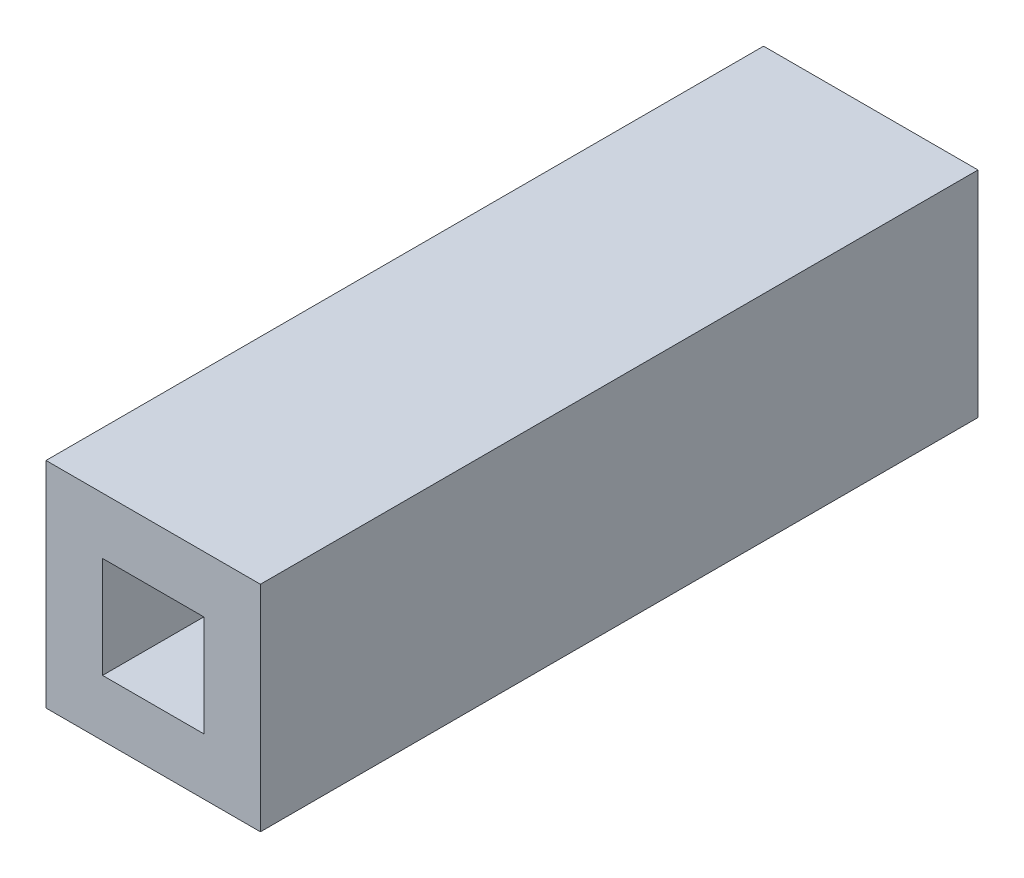
ISO-10303-21;
HEADER;
FILE_DESCRIPTION(('STEP AP214'),'2;1');
FILE_NAME('part.step','',(''),(''),'','','');
FILE_SCHEMA(('AUTOMOTIVE_DESIGN { 1 0 10303 214 1 1 1 1 }'));
ENDSEC;
DATA;
#1=APPLICATION_CONTEXT('core data for automotive mechanical design processes');
#2=APPLICATION_PROTOCOL_DEFINITION('international standard','automotive_design',2000,#1);
#3=PRODUCT_CONTEXT('',#1,'mechanical');
#4=PRODUCT('Part','Part','',(#3));
#5=PRODUCT_RELATED_PRODUCT_CATEGORY('part','',(#4));
#6=PRODUCT_DEFINITION_FORMATION('','',#4);
#7=PRODUCT_DEFINITION_CONTEXT('part definition',#1,'design');
#8=PRODUCT_DEFINITION('design','',#6,#7);
#9=PRODUCT_DEFINITION_SHAPE('','',#8);
#10=(LENGTH_UNIT() NAMED_UNIT(*) SI_UNIT(.MILLI.,.METRE.));
#11=(NAMED_UNIT(*) PLANE_ANGLE_UNIT() SI_UNIT($,.RADIAN.));
#12=(NAMED_UNIT(*) SI_UNIT($,.STERADIAN.) SOLID_ANGLE_UNIT());
#13=UNCERTAINTY_MEASURE_WITH_UNIT(LENGTH_MEASURE(1.E-05),#10,'distance_accuracy_value','');
#14=(GEOMETRIC_REPRESENTATION_CONTEXT(3) GLOBAL_UNCERTAINTY_ASSIGNED_CONTEXT((#13)) GLOBAL_UNIT_ASSIGNED_CONTEXT((#10,
#11,#12)) REPRESENTATION_CONTEXT('',''));
#15=CARTESIAN_POINT('',(0.,0.,0.));
#16=DIRECTION('',(0.,0.,1.));
#17=DIRECTION('',(1.,0.,0.));
#18=AXIS2_PLACEMENT_3D('',#15,#16,#17);
#19=CARTESIAN_POINT('',(7.841173791275,29.409000078524,-10.));
#20=DIRECTION('',(1.,0.,0.));
#21=DIRECTION('',(0.,1.,0.));
#22=AXIS2_PLACEMENT_3D('',#19,#20,#21);
#23=PLANE('',#22);
#24=DIRECTION('',(0.,1.,0.));
#25=VECTOR('',#24,1.);
#26=CARTESIAN_POINT('',(7.841173791275,29.409000078524,-1.5));
#27=LINE('',#26,#25);
#28=CARTESIAN_POINT('',(7.841173791275,28.139000078524,-1.5));
#29=VERTEX_POINT('',#28);
#30=CARTESIAN_POINT('',(7.841173791275,30.679000078524,-1.5));
#31=VERTEX_POINT('',#30);
#32=EDGE_CURVE('E224',#29,#31,#27,.T.);
#33=ORIENTED_EDGE('',*,*,#32,.F.);
#34=DIRECTION('',(0.,0.,1.));
#35=VECTOR('',#34,1.);
#36=CARTESIAN_POINT('',(7.841173791275,28.139000078524,-10.));
#37=LINE('',#36,#35);
#38=CARTESIAN_POINT('',(7.841173791275,28.139000078524,-10.));
#39=VERTEX_POINT('',#38);
#40=EDGE_CURVE('E11',#39,#29,#37,.T.);
#41=ORIENTED_EDGE('',*,*,#40,.F.);
#42=DIRECTION('',(0.,1.,0.));
#43=VECTOR('',#42,1.);
#44=CARTESIAN_POINT('',(7.841173791275,29.409000078524,-10.));
#45=LINE('',#44,#43);
#46=CARTESIAN_POINT('',(7.841173791275,30.679000078524,-10.));
#47=VERTEX_POINT('',#46);
#48=EDGE_CURVE('E181',#39,#47,#45,.T.);
#49=ORIENTED_EDGE('',*,*,#48,.T.);
#50=DIRECTION('',(0.,0.,1.));
#51=VECTOR('',#50,1.);
#52=CARTESIAN_POINT('',(7.841173791275,30.679000078524,-10.));
#53=LINE('',#52,#51);
#54=EDGE_CURVE('E21',#47,#31,#53,.T.);
#55=ORIENTED_EDGE('',*,*,#54,.T.);
#56=EDGE_LOOP('',(#33,#41,#49,#55));
#57=FACE_BOUND('',#56,.T.);
#58=ADVANCED_FACE('F17',(#57),#23,.T.);
#59=CARTESIAN_POINT('',(6.571173791275,28.139000078524,-10.));
#60=DIRECTION('',(0.,1.,0.));
#61=DIRECTION('',(1.,0.,0.));
#62=AXIS2_PLACEMENT_3D('',#59,#60,#61);
#63=PLANE('',#62);
#64=DIRECTION('',(-1.,0.,0.));
#65=VECTOR('',#64,1.);
#66=CARTESIAN_POINT('',(6.571173791275,28.139000078524,-1.5));
#67=LINE('',#66,#65);
#68=CARTESIAN_POINT('',(5.301173791275,28.139000078524,-1.5));
#69=VERTEX_POINT('',#68);
#70=EDGE_CURVE('E186',#29,#69,#67,.T.);
#71=ORIENTED_EDGE('',*,*,#70,.T.);
#72=DIRECTION('',(0.,0.,1.));
#73=VECTOR('',#72,1.);
#74=CARTESIAN_POINT('',(5.301173791275,28.139000078524,-10.));
#75=LINE('',#74,#73);
#76=CARTESIAN_POINT('',(5.301173791275,28.139000078524,-10.));
#77=VERTEX_POINT('',#76);
#78=EDGE_CURVE('E27',#77,#69,#75,.T.);
#79=ORIENTED_EDGE('',*,*,#78,.F.);
#80=DIRECTION('',(-1.,0.,0.));
#81=VECTOR('',#80,1.);
#82=CARTESIAN_POINT('',(6.571173791275,28.139000078524,-10.));
#83=LINE('',#82,#81);
#84=EDGE_CURVE('E177',#39,#77,#83,.T.);
#85=ORIENTED_EDGE('',*,*,#84,.F.);
#86=ORIENTED_EDGE('',*,*,#40,.T.);
#87=EDGE_LOOP('',(#71,#79,#85,#86));
#88=FACE_BOUND('',#87,.T.);
#89=ADVANCED_FACE('F19',(#88),#63,.F.);
#90=CARTESIAN_POINT('',(5.301173791275,29.409000078524,-10.));
#91=DIRECTION('',(1.,0.,0.));
#92=DIRECTION('',(0.,1.,0.));
#93=AXIS2_PLACEMENT_3D('',#90,#91,#92);
#94=PLANE('',#93);
#95=DIRECTION('',(0.,1.,0.));
#96=VECTOR('',#95,1.);
#97=CARTESIAN_POINT('',(5.301173791275,29.409000078524,-1.5));
#98=LINE('',#97,#96);
#99=CARTESIAN_POINT('',(5.301173791275,30.679000078524,-1.5));
#100=VERTEX_POINT('',#99);
#101=EDGE_CURVE('E232',#69,#100,#98,.T.);
#102=ORIENTED_EDGE('',*,*,#101,.T.);
#103=DIRECTION('',(0.,0.,1.));
#104=VECTOR('',#103,1.);
#105=CARTESIAN_POINT('',(5.301173791275,30.679000078524,-10.));
#106=LINE('',#105,#104);
#107=CARTESIAN_POINT('',(5.301173791275,30.679000078524,-10.));
#108=VERTEX_POINT('',#107);
#109=EDGE_CURVE('E40',#108,#100,#106,.T.);
#110=ORIENTED_EDGE('',*,*,#109,.F.);
#111=DIRECTION('',(0.,1.,0.));
#112=VECTOR('',#111,1.);
#113=CARTESIAN_POINT('',(5.301173791275,29.409000078524,-10.));
#114=LINE('',#113,#112);
#115=EDGE_CURVE('E180',#77,#108,#114,.T.);
#116=ORIENTED_EDGE('',*,*,#115,.F.);
#117=ORIENTED_EDGE('',*,*,#78,.T.);
#118=EDGE_LOOP('',(#102,#110,#116,#117));
#119=FACE_BOUND('',#118,.T.);
#120=ADVANCED_FACE('F257',(#119),#94,.F.);
#121=CARTESIAN_POINT('',(6.571173791275,30.679000078524,-10.));
#122=DIRECTION('',(0.,1.,0.));
#123=DIRECTION('',(1.,0.,0.));
#124=AXIS2_PLACEMENT_3D('',#121,#122,#123);
#125=PLANE('',#124);
#126=DIRECTION('',(-1.,0.,0.));
#127=VECTOR('',#126,1.);
#128=CARTESIAN_POINT('',(6.571173791275,30.679000078524,-1.5));
#129=LINE('',#128,#127);
#130=EDGE_CURVE('E228',#31,#100,#129,.T.);
#131=ORIENTED_EDGE('',*,*,#130,.F.);
#132=ORIENTED_EDGE('',*,*,#54,.F.);
#133=DIRECTION('',(-1.,0.,0.));
#134=VECTOR('',#133,1.);
#135=CARTESIAN_POINT('',(6.571173791275,30.679000078524,-10.));
#136=LINE('',#135,#134);
#137=EDGE_CURVE('E239',#47,#108,#136,.T.);
#138=ORIENTED_EDGE('',*,*,#137,.T.);
#139=ORIENTED_EDGE('',*,*,#109,.T.);
#140=EDGE_LOOP('',(#131,#132,#138,#139));
#141=FACE_BOUND('',#140,.T.);
#142=ADVANCED_FACE('F252',(#141),#125,.T.);
#143=CARTESIAN_POINT('',(6.571173791275,29.409000078524,-10.));
#144=DIRECTION('',(0.,0.,-1.));
#145=DIRECTION('',(0.,-1.,0.));
#146=AXIS2_PLACEMENT_3D('',#143,#144,#145);
#147=PLANE('',#146);
#148=DIRECTION('',(1.,0.,0.));
#149=VECTOR('',#148,1.);
#150=CARTESIAN_POINT('',(7.171173791275,28.459000078524,-10.));
#151=LINE('',#150,#149);
#152=CARTESIAN_POINT('',(5.621173791275,28.459000078524,-10.));
#153=VERTEX_POINT('',#152);
#154=CARTESIAN_POINT('',(7.521173791275,28.459000078524,-10.));
#155=VERTEX_POINT('',#154);
#156=EDGE_CURVE('E122',#153,#155,#151,.T.);
#157=ORIENTED_EDGE('',*,*,#156,.T.);
#158=DIRECTION('',(0.,1.,0.));
#159=VECTOR('',#158,1.);
#160=CARTESIAN_POINT('',(7.521173791275,29.409000078524,-10.));
#161=LINE('',#160,#159);
#162=CARTESIAN_POINT('',(7.521173791275,30.359000078524,-10.));
#163=VERTEX_POINT('',#162);
#164=EDGE_CURVE('E127',#155,#163,#161,.T.);
#165=ORIENTED_EDGE('',*,*,#164,.T.);
#166=DIRECTION('',(-1.,0.,0.));
#167=VECTOR('',#166,1.);
#168=CARTESIAN_POINT('',(6.571173791275,30.359000078524,-10.));
#169=LINE('',#168,#167);
#170=CARTESIAN_POINT('',(5.621173791275,30.359000078524,-10.));
#171=VERTEX_POINT('',#170);
#172=EDGE_CURVE('E163',#163,#171,#169,.T.);
#173=ORIENTED_EDGE('',*,*,#172,.T.);
#174=DIRECTION('',(0.,-1.,0.));
#175=VECTOR('',#174,1.);
#176=CARTESIAN_POINT('',(5.621173791275,28.809000078524,-10.));
#177=LINE('',#176,#175);
#178=EDGE_CURVE('E129',#171,#153,#177,.T.);
#179=ORIENTED_EDGE('',*,*,#178,.T.);
#180=EDGE_LOOP('',(#157,#165,#173,#179));
#181=FACE_BOUND('',#180,.T.);
#182=ORIENTED_EDGE('',*,*,#48,.F.);
#183=ORIENTED_EDGE('',*,*,#84,.T.);
#184=ORIENTED_EDGE('',*,*,#115,.T.);
#185=ORIENTED_EDGE('',*,*,#137,.F.);
#186=EDGE_LOOP('',(#182,#183,#184,#185));
#187=FACE_BOUND('',#186,.T.);
#188=ADVANCED_FACE('F124',(#181,#187),#147,.T.);
#189=CARTESIAN_POINT('',(6.571173791275,29.409000078524,-1.5));
#190=DIRECTION('',(0.,0.,-1.));
#191=DIRECTION('',(0.,-1.,0.));
#192=AXIS2_PLACEMENT_3D('',#189,#190,#191);
#193=PLANE('',#192);
#194=DIRECTION('',(0.,-1.,0.));
#195=VECTOR('',#194,1.);
#196=CARTESIAN_POINT('',(7.171173791275,29.409000078524,-1.5));
#197=LINE('',#196,#195);
#198=CARTESIAN_POINT('',(7.171173791275,30.009000078524,-1.5));
#199=VERTEX_POINT('',#198);
#200=CARTESIAN_POINT('',(7.171173791275,28.809000078524,-1.5));
#201=VERTEX_POINT('',#200);
#202=EDGE_CURVE('E217',#199,#201,#197,.T.);
#203=ORIENTED_EDGE('',*,*,#202,.T.);
#204=DIRECTION('',(1.,0.,0.));
#205=VECTOR('',#204,1.);
#206=CARTESIAN_POINT('',(6.571173791275,28.809000078524,-1.5));
#207=LINE('',#206,#205);
#208=CARTESIAN_POINT('',(5.971173791275,28.809000078524,-1.5));
#209=VERTEX_POINT('',#208);
#210=EDGE_CURVE('E220',#209,#201,#207,.T.);
#211=ORIENTED_EDGE('',*,*,#210,.F.);
#212=DIRECTION('',(0.,-1.,0.));
#213=VECTOR('',#212,1.);
#214=CARTESIAN_POINT('',(5.971173791275,29.409000078524,-1.5));
#215=LINE('',#214,#213);
#216=CARTESIAN_POINT('',(5.971173791275,30.009000078524,-1.5));
#217=VERTEX_POINT('',#216);
#218=EDGE_CURVE('E205',#217,#209,#215,.T.);
#219=ORIENTED_EDGE('',*,*,#218,.F.);
#220=DIRECTION('',(1.,0.,0.));
#221=VECTOR('',#220,1.);
#222=CARTESIAN_POINT('',(6.571173791275,30.009000078524,-1.5));
#223=LINE('',#222,#221);
#224=EDGE_CURVE('E198',#217,#199,#223,.T.);
#225=ORIENTED_EDGE('',*,*,#224,.T.);
#226=EDGE_LOOP('',(#203,#211,#219,#225));
#227=FACE_BOUND('',#226,.T.);
#228=ORIENTED_EDGE('',*,*,#32,.T.);
#229=ORIENTED_EDGE('',*,*,#130,.T.);
#230=ORIENTED_EDGE('',*,*,#101,.F.);
#231=ORIENTED_EDGE('',*,*,#70,.F.);
#232=EDGE_LOOP('',(#228,#229,#230,#231));
#233=FACE_BOUND('',#232,.T.);
#234=ADVANCED_FACE('F256',(#227,#233),#193,.F.);
#235=CARTESIAN_POINT('',(6.571173791275,28.809000078524,-1.498));
#236=DIRECTION('',(0.,-1.,0.));
#237=DIRECTION('',(0.,0.,-1.));
#238=AXIS2_PLACEMENT_3D('',#235,#236,#237);
#239=PLANE('',#238);
#240=DIRECTION('',(0.,0.,-1.));
#241=VECTOR('',#240,1.);
#242=CARTESIAN_POINT('',(7.171173791275,28.809000078524,-1.498));
#243=LINE('',#242,#241);
#244=CARTESIAN_POINT('',(7.171173791275,28.809000078524,-9.65));
#245=VERTEX_POINT('',#244);
#246=EDGE_CURVE('E214',#201,#245,#243,.T.);
#247=ORIENTED_EDGE('',*,*,#246,.T.);
#248=DIRECTION('',(-1.,0.,0.));
#249=VECTOR('',#248,1.);
#250=CARTESIAN_POINT('',(5.971173791275,28.809000078524,-9.65));
#251=LINE('',#250,#249);
#252=CARTESIAN_POINT('',(5.971173791275,28.809000078524,-9.65));
#253=VERTEX_POINT('',#252);
#254=EDGE_CURVE('E136',#245,#253,#251,.T.);
#255=ORIENTED_EDGE('',*,*,#254,.T.);
#256=DIRECTION('',(0.,0.,-1.));
#257=VECTOR('',#256,1.);
#258=CARTESIAN_POINT('',(5.971173791275,28.809000078524,-1.498));
#259=LINE('',#258,#257);
#260=EDGE_CURVE('E202',#209,#253,#259,.T.);
#261=ORIENTED_EDGE('',*,*,#260,.F.);
#262=ORIENTED_EDGE('',*,*,#210,.T.);
#263=EDGE_LOOP('',(#247,#255,#261,#262));
#264=FACE_BOUND('',#263,.T.);
#265=ADVANCED_FACE('F313',(#264),#239,.F.);
#266=CARTESIAN_POINT('',(7.171173791275,29.409000078524,-1.498));
#267=DIRECTION('',(-1.,0.,0.));
#268=DIRECTION('',(0.,1.,0.));
#269=AXIS2_PLACEMENT_3D('',#266,#267,#268);
#270=PLANE('',#269);
#271=DIRECTION('',(0.,0.,-1.));
#272=VECTOR('',#271,1.);
#273=CARTESIAN_POINT('',(7.171173791275,30.009000078524,-1.498));
#274=LINE('',#273,#272);
#275=CARTESIAN_POINT('',(7.171173791275,30.009000078524,-9.65));
#276=VERTEX_POINT('',#275);
#277=EDGE_CURVE('E195',#199,#276,#274,.T.);
#278=ORIENTED_EDGE('',*,*,#277,.T.);
#279=DIRECTION('',(0.,-1.,0.));
#280=VECTOR('',#279,1.);
#281=CARTESIAN_POINT('',(7.171173791275,29.409000078524,-9.65));
#282=LINE('',#281,#280);
#283=EDGE_CURVE('E153',#276,#245,#282,.T.);
#284=ORIENTED_EDGE('',*,*,#283,.T.);
#285=ORIENTED_EDGE('',*,*,#246,.F.);
#286=ORIENTED_EDGE('',*,*,#202,.F.);
#287=EDGE_LOOP('',(#278,#284,#285,#286));
#288=FACE_BOUND('',#287,.T.);
#289=ADVANCED_FACE('F318',(#288),#270,.T.);
#290=CARTESIAN_POINT('',(5.971173791275,29.409000078524,-1.498));
#291=DIRECTION('',(-1.,0.,0.));
#292=DIRECTION('',(0.,1.,0.));
#293=AXIS2_PLACEMENT_3D('',#290,#291,#292);
#294=PLANE('',#293);
#295=ORIENTED_EDGE('',*,*,#260,.T.);
#296=DIRECTION('',(0.,1.,0.));
#297=VECTOR('',#296,1.);
#298=CARTESIAN_POINT('',(5.971173791275,30.009000078524,-9.65));
#299=LINE('',#298,#297);
#300=CARTESIAN_POINT('',(5.971173791275,30.009000078524,-9.65));
#301=VERTEX_POINT('',#300);
#302=EDGE_CURVE('E135',#253,#301,#299,.T.);
#303=ORIENTED_EDGE('',*,*,#302,.T.);
#304=DIRECTION('',(0.,0.,-1.));
#305=VECTOR('',#304,1.);
#306=CARTESIAN_POINT('',(5.971173791275,30.009000078524,-1.498));
#307=LINE('',#306,#305);
#308=EDGE_CURVE('E199',#217,#301,#307,.T.);
#309=ORIENTED_EDGE('',*,*,#308,.F.);
#310=ORIENTED_EDGE('',*,*,#218,.T.);
#311=EDGE_LOOP('',(#295,#303,#309,#310));
#312=FACE_BOUND('',#311,.T.);
#313=ADVANCED_FACE('F324',(#312),#294,.F.);
#314=CARTESIAN_POINT('',(6.571173791275,30.009000078524,-1.498));
#315=DIRECTION('',(0.,-1.,0.));
#316=DIRECTION('',(0.,0.,-1.));
#317=AXIS2_PLACEMENT_3D('',#314,#315,#316);
#318=PLANE('',#317);
#319=ORIENTED_EDGE('',*,*,#308,.T.);
#320=DIRECTION('',(1.,0.,0.));
#321=VECTOR('',#320,1.);
#322=CARTESIAN_POINT('',(6.571173791275,30.009000078524,-9.65));
#323=LINE('',#322,#321);
#324=EDGE_CURVE('E176',#301,#276,#323,.T.);
#325=ORIENTED_EDGE('',*,*,#324,.T.);
#326=ORIENTED_EDGE('',*,*,#277,.F.);
#327=ORIENTED_EDGE('',*,*,#224,.F.);
#328=EDGE_LOOP('',(#319,#325,#326,#327));
#329=FACE_BOUND('',#328,.T.);
#330=ADVANCED_FACE('F329',(#329),#318,.T.);
#331=CARTESIAN_POINT('',(5.971173791275,29.409000078524,-9.65));
#332=DIRECTION('',(0.707106781186548,0.,-0.707106781186548));
#333=DIRECTION('',(0.,-1.,0.));
#334=AXIS2_PLACEMENT_3D('',#331,#332,#333);
#335=PLANE('',#334);
#336=DIRECTION('',(-0.577350269189626,0.577350269189626,-0.577350269189626));
#337=VECTOR('',#336,1.);
#338=CARTESIAN_POINT('',(5.937840457942,30.042333411858,-9.683333333333));
#339=LINE('',#338,#337);
#340=EDGE_CURVE('E146',#301,#171,#339,.T.);
#341=ORIENTED_EDGE('',*,*,#340,.F.);
#342=ORIENTED_EDGE('',*,*,#302,.F.);
#343=DIRECTION('',(0.577350269189626,0.577350269189626,0.577350269189626));
#344=VECTOR('',#343,1.);
#345=CARTESIAN_POINT('',(6.171173791275,29.009000078524,-9.45));
#346=LINE('',#345,#344);
#347=EDGE_CURVE('E171',#153,#253,#346,.T.);
#348=ORIENTED_EDGE('',*,*,#347,.F.);
#349=ORIENTED_EDGE('',*,*,#178,.F.);
#350=EDGE_LOOP('',(#341,#342,#348,#349));
#351=FACE_BOUND('',#350,.T.);
#352=ADVANCED_FACE('F338',(#351),#335,.T.);
#353=CARTESIAN_POINT('',(6.571173791275,28.809000078524,-9.65));
#354=DIRECTION('',(0.,0.707106781186548,-0.707106781186548));
#355=DIRECTION('',(-1.,0.,0.));
#356=AXIS2_PLACEMENT_3D('',#353,#354,#355);
#357=PLANE('',#356);
#358=ORIENTED_EDGE('',*,*,#347,.T.);
#359=ORIENTED_EDGE('',*,*,#254,.F.);
#360=DIRECTION('',(-0.577350269189626,0.577350269189626,0.577350269189626));
#361=VECTOR('',#360,1.);
#362=CARTESIAN_POINT('',(7.204507124608,28.775666745191,-9.683333333333));
#363=LINE('',#362,#361);
#364=EDGE_CURVE('E142',#155,#245,#363,.T.);
#365=ORIENTED_EDGE('',*,*,#364,.F.);
#366=ORIENTED_EDGE('',*,*,#156,.F.);
#367=EDGE_LOOP('',(#358,#359,#365,#366));
#368=FACE_BOUND('',#367,.T.);
#369=ADVANCED_FACE('F149',(#368),#357,.T.);
#370=CARTESIAN_POINT('',(6.571173791275,30.359000078524,-10.));
#371=DIRECTION('',(0.,0.707106781186548,0.707106781186548));
#372=DIRECTION('',(1.,0.,0.));
#373=AXIS2_PLACEMENT_3D('',#370,#371,#372);
#374=PLANE('',#373);
#375=ORIENTED_EDGE('',*,*,#340,.T.);
#376=ORIENTED_EDGE('',*,*,#172,.F.);
#377=DIRECTION('',(-0.577350269189626,-0.577350269189626,0.577350269189626));
#378=VECTOR('',#377,1.);
#379=CARTESIAN_POINT('',(7.204507124608,30.042333411858,-9.683333333333));
#380=LINE('',#379,#378);
#381=EDGE_CURVE('E144',#163,#276,#380,.T.);
#382=ORIENTED_EDGE('',*,*,#381,.T.);
#383=ORIENTED_EDGE('',*,*,#324,.F.);
#384=EDGE_LOOP('',(#375,#376,#382,#383));
#385=FACE_BOUND('',#384,.T.);
#386=ADVANCED_FACE('F369',(#385),#374,.F.);
#387=CARTESIAN_POINT('',(7.521173791275,29.409000078524,-10.));
#388=DIRECTION('',(0.707106781186548,0.,0.707106781186548));
#389=DIRECTION('',(0.,-1.,0.));
#390=AXIS2_PLACEMENT_3D('',#387,#388,#389);
#391=PLANE('',#390);
#392=ORIENTED_EDGE('',*,*,#364,.T.);
#393=ORIENTED_EDGE('',*,*,#283,.F.);
#394=ORIENTED_EDGE('',*,*,#381,.F.);
#395=ORIENTED_EDGE('',*,*,#164,.F.);
#396=EDGE_LOOP('',(#392,#393,#394,#395));
#397=FACE_BOUND('',#396,.T.);
#398=ADVANCED_FACE('F140',(#397),#391,.F.);
#399=CLOSED_SHELL('',(#58,#89,#120,#142,#188,#234,#265,#289,#313,#330,#352,#369,#386,#398));
#400=MANIFOLD_SOLID_BREP('B1',#399);
#401=ADVANCED_BREP_SHAPE_REPRESENTATION('',(#18,#400),#14);
#402=SHAPE_DEFINITION_REPRESENTATION(#9,#401);
ENDSEC;
END-ISO-10303-21;
